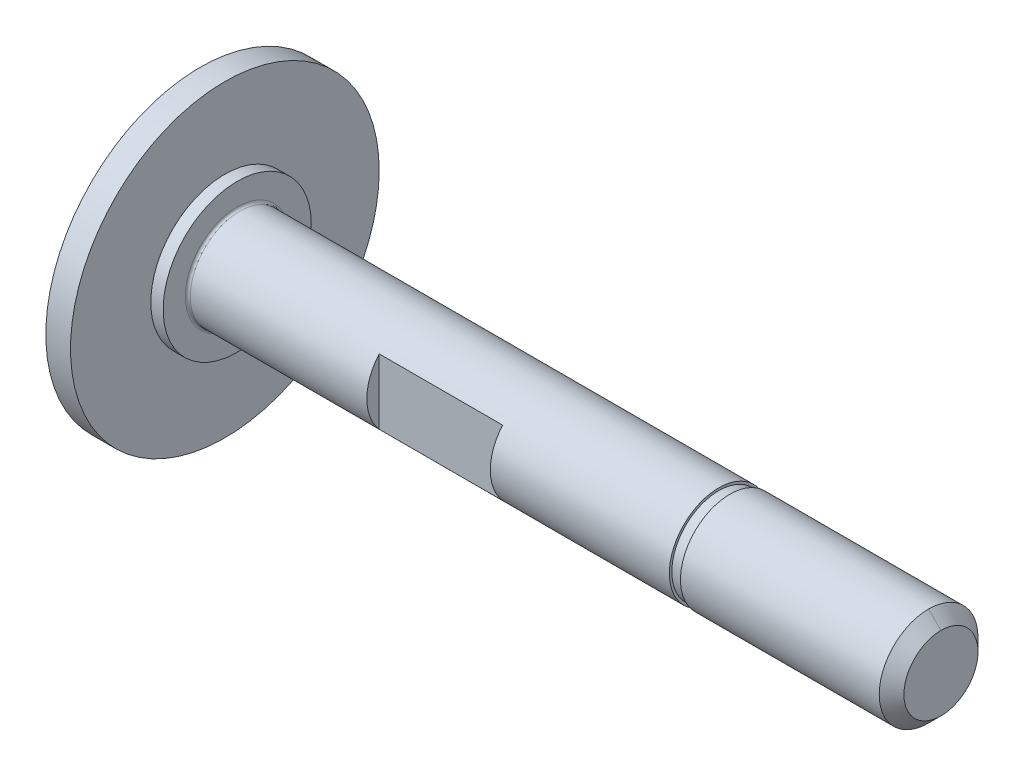
ISO-10303-21;
HEADER;
FILE_DESCRIPTION(('STEP AP214'),'2;1');
FILE_NAME('part.step','',(''),(''),'','','');
FILE_SCHEMA(('AUTOMOTIVE_DESIGN { 1 0 10303 214 1 1 1 1 }'));
ENDSEC;
DATA;
#1=APPLICATION_CONTEXT('core data for automotive mechanical design processes');
#2=APPLICATION_PROTOCOL_DEFINITION('international standard','automotive_design',2000,#1);
#3=PRODUCT_CONTEXT('',#1,'mechanical');
#4=PRODUCT('Part','Part','',(#3));
#5=PRODUCT_RELATED_PRODUCT_CATEGORY('part','',(#4));
#6=PRODUCT_DEFINITION_FORMATION('','',#4);
#7=PRODUCT_DEFINITION_CONTEXT('part definition',#1,'design');
#8=PRODUCT_DEFINITION('design','',#6,#7);
#9=PRODUCT_DEFINITION_SHAPE('','',#8);
#10=(LENGTH_UNIT() NAMED_UNIT(*) SI_UNIT(.MILLI.,.METRE.));
#11=(NAMED_UNIT(*) PLANE_ANGLE_UNIT() SI_UNIT($,.RADIAN.));
#12=(NAMED_UNIT(*) SI_UNIT($,.STERADIAN.) SOLID_ANGLE_UNIT());
#13=UNCERTAINTY_MEASURE_WITH_UNIT(LENGTH_MEASURE(1.E-05),#10,'distance_accuracy_value','');
#14=(GEOMETRIC_REPRESENTATION_CONTEXT(3) GLOBAL_UNCERTAINTY_ASSIGNED_CONTEXT((#13)) GLOBAL_UNIT_ASSIGNED_CONTEXT((#10,
#11,#12)) REPRESENTATION_CONTEXT('',''));
#15=CARTESIAN_POINT('',(0.,0.,0.));
#16=DIRECTION('',(0.,0.,1.));
#17=DIRECTION('',(1.,0.,0.));
#18=AXIS2_PLACEMENT_3D('',#15,#16,#17);
#19=CARTESIAN_POINT('',(60.,0.,0.));
#20=DIRECTION('',(1.,0.,0.));
#21=DIRECTION('',(0.,0.,-1.));
#22=AXIS2_PLACEMENT_3D('',#19,#20,#21);
#23=PLANE('',#22);
#24=CARTESIAN_POINT('',(60.0000000000495,0.,-5.71552570961101E-13));
#25=DIRECTION('',(-1.,0.,5.71877831696545E-13));
#26=DIRECTION('',(5.71877831696545E-13,0.,1.));
#27=AXIS2_PLACEMENT_3D('',#24,#25,#26);
#28=CIRCLE('',#27,2.999999999943);
#29=CARTESIAN_POINT('',(60.0000000000259,2.99999999992904,0.));
#30=VERTEX_POINT('',#29);
#31=CARTESIAN_POINT('',(59.9999999999974,-2.99999999996447,1.42733722536464E-07));
#32=VERTEX_POINT('',#31);
#33=EDGE_CURVE('E62',#30,#32,#28,.T.);
#34=ORIENTED_EDGE('',*,*,#33,.F.);
#35=CARTESIAN_POINT('',(59.9999999999454,0.,0.));
#36=DIRECTION('',(-1.,0.,0.));
#37=DIRECTION('',(0.,-1.,0.));
#38=AXIS2_PLACEMENT_3D('',#35,#36,#37);
#39=CIRCLE('',#38,2.9999999999859);
#40=EDGE_CURVE('E76',#32,#30,#39,.T.);
#41=ORIENTED_EDGE('',*,*,#40,.F.);
#42=EDGE_LOOP('',(#34,#41));
#43=FACE_BOUND('',#42,.T.);
#44=ADVANCED_FACE('F16',(#43),#23,.T.);
#45=CARTESIAN_POINT('',(59.0000000001958,0.,0.));
#46=DIRECTION('',(-1.,0.,5.71877831696545E-13));
#47=DIRECTION('',(5.71877831696545E-13,0.,1.));
#48=AXIS2_PLACEMENT_3D('',#45,#46,#47);
#49=CONICAL_SURFACE('',#48,3.99999999980718,0.785398163402721);
#50=DIRECTION('',(0.707106781186865,-0.70710678118623,0.));
#51=VECTOR('',#50,1.);
#52=CARTESIAN_POINT('',(-498937.000000448,499000.,-3.73431461534899E-11));
#53=LINE('',#52,#51);
#54=CARTESIAN_POINT('',(59.0000000000065,3.99999999999056,0.));
#55=VERTEX_POINT('',#54);
#56=EDGE_CURVE('E72',#30,#55,#53,.F.);
#57=ORIENTED_EDGE('',*,*,#56,.F.);
#58=ORIENTED_EDGE('',*,*,#33,.T.);
#59=CARTESIAN_POINT('',(59.0000000000259,-3.99999999996226,0.));
#60=CARTESIAN_POINT('',(59.0416666666631,-3.95833333330594,7.92965032878056E-09));
#61=CARTESIAN_POINT('',(59.083333333298,-3.91666666664742,1.5611499840076E-08));
#62=CARTESIAN_POINT('',(59.1666666666248,-3.83333333329248,3.04795962298971E-08));
#63=CARTESIAN_POINT('',(59.2083333333165,-3.79166666659607,3.76658431078594E-08));
#64=CARTESIAN_POINT('',(59.2916666666951,-3.708333333255,5.15427336929541E-08));
#65=CARTESIAN_POINT('',(59.3333333333818,-3.66666666661035,5.82333774004246E-08));
#66=CARTESIAN_POINT('',(59.4166666667092,-3.58333333327505,7.11190608004908E-08));
#67=CARTESIAN_POINT('',(59.4583333333499,-3.54166666658439,7.73141004930864E-08));
#68=CARTESIAN_POINT('',(59.5416666666783,-3.45833333325008,8.92085766418609E-08));
#69=CARTESIAN_POINT('',(59.583333333366,-3.41666666660643,9.49080130980397E-08));
#70=CARTESIAN_POINT('',(59.6666666666847,-3.33333333331922,1.05811283841286E-07));
#71=CARTESIAN_POINT('',(59.7083333333157,-3.29166666667566,1.11015118128691E-07));
#72=CARTESIAN_POINT('',(59.7916666666439,-3.20833333334116,1.20927182391884E-07));
#73=CARTESIAN_POINT('',(59.8333333333411,-3.16666666665021,1.25635412366996E-07));
#74=CARTESIAN_POINT('',(59.9166666666788,-3.08333333330621,1.34556269574104E-07));
#75=CARTESIAN_POINT('',(59.9583333333192,-3.04166666665315,1.38768896806664E-07));
#76=CARTESIAN_POINT('',(59.9999999999454,-2.9999999999859,1.42733723461607E-07));
#77=B_SPLINE_CURVE_WITH_KNOTS('',3,(#59,#60,#61,#62,#63,#64,#65,#66,#67,#68,#69,#70,#71,#72,#73,
#74,#75,#76),.UNSPECIFIED.,.F.,.F.,(4,2,2,2,2,2,2,2,4),(0.,0.176776695212069,0.353553390625111,
0.530330085917569,0.707106781210027,0.883883476502484,1.06066017167436,1.2374368670874,
1.41421356229947),.UNSPECIFIED.);
#78=CARTESIAN_POINT('',(59.0000000000065,-3.99999999999056,0.));
#79=VERTEX_POINT('',#78);
#80=EDGE_CURVE('E70',#79,#32,#77,.T.);
#81=ORIENTED_EDGE('',*,*,#80,.F.);
#82=CARTESIAN_POINT('',(59.,0.,0.));
#83=DIRECTION('',(1.,0.,0.));
#84=DIRECTION('',(0.,0.,-1.));
#85=AXIS2_PLACEMENT_3D('',#82,#83,#84);
#86=CIRCLE('',#85,4.);
#87=EDGE_CURVE('E80',#55,#79,#86,.F.);
#88=ORIENTED_EDGE('',*,*,#87,.F.);
#89=EDGE_LOOP('',(#57,#58,#81,#88));
#90=FACE_BOUND('',#89,.T.);
#91=ADVANCED_FACE('F68',(#90),#49,.T.);
#92=CARTESIAN_POINT('',(59.0000000000259,0.,0.));
#93=DIRECTION('',(-1.,0.,0.));
#94=DIRECTION('',(0.,-1.,0.));
#95=AXIS2_PLACEMENT_3D('',#92,#93,#94);
#96=CONICAL_SURFACE('',#95,3.99999999996226,0.785398163425874);
#97=ORIENTED_EDGE('',*,*,#80,.T.);
#98=ORIENTED_EDGE('',*,*,#40,.T.);
#99=ORIENTED_EDGE('',*,*,#56,.T.);
#100=CARTESIAN_POINT('',(59.,0.,0.));
#101=DIRECTION('',(1.,0.,0.));
#102=DIRECTION('',(0.,0.,-1.));
#103=AXIS2_PLACEMENT_3D('',#100,#101,#102);
#104=CIRCLE('',#103,4.);
#105=EDGE_CURVE('E78',#79,#55,#104,.F.);
#106=ORIENTED_EDGE('',*,*,#105,.F.);
#107=EDGE_LOOP('',(#97,#98,#99,#106));
#108=FACE_BOUND('',#107,.T.);
#109=ADVANCED_FACE('F75',(#108),#96,.T.);
#110=CARTESIAN_POINT('',(31.5,0.,0.));
#111=DIRECTION('',(1.,0.,0.));
#112=DIRECTION('',(0.,0.,-1.));
#113=AXIS2_PLACEMENT_3D('',#110,#111,#112);
#114=CYLINDRICAL_SURFACE('',#113,4.);
#115=ORIENTED_EDGE('',*,*,#87,.T.);
#116=ORIENTED_EDGE('',*,*,#105,.T.);
#117=EDGE_LOOP('',(#115,#116));
#118=FACE_BOUND('',#117,.T.);
#119=CARTESIAN_POINT('',(42.9,0.,0.));
#120=DIRECTION('',(1.,0.,0.));
#121=DIRECTION('',(0.,0.,-1.));
#122=AXIS2_PLACEMENT_3D('',#119,#120,#121);
#123=CIRCLE('',#122,4.);
#124=CARTESIAN_POINT('',(42.9,0.,-4.));
#125=VERTEX_POINT('',#124);
#126=EDGE_CURVE('E84',#125,#125,#123,.T.);
#127=ORIENTED_EDGE('',*,*,#126,.T.);
#128=EDGE_LOOP('',(#127));
#129=FACE_BOUND('',#128,.T.);
#130=ADVANCED_FACE('F129',(#118,#129),#114,.T.);
#131=CARTESIAN_POINT('',(42.9,3.8,0.));
#132=DIRECTION('',(1.,0.,0.));
#133=DIRECTION('',(0.,0.,-1.));
#134=AXIS2_PLACEMENT_3D('',#131,#132,#133);
#135=PLANE('',#134);
#136=CARTESIAN_POINT('',(42.9,0.,0.));
#137=DIRECTION('',(1.,0.,0.));
#138=DIRECTION('',(0.,0.,-1.));
#139=AXIS2_PLACEMENT_3D('',#136,#137,#138);
#140=CIRCLE('',#139,3.8);
#141=CARTESIAN_POINT('',(42.9,0.,-3.8));
#142=VERTEX_POINT('',#141);
#143=EDGE_CURVE('E151',#142,#142,#140,.F.);
#144=ORIENTED_EDGE('',*,*,#143,.F.);
#145=EDGE_LOOP('',(#144));
#146=FACE_BOUND('',#145,.T.);
#147=ORIENTED_EDGE('',*,*,#126,.F.);
#148=EDGE_LOOP('',(#147));
#149=FACE_BOUND('',#148,.T.);
#150=ADVANCED_FACE('F159',(#146,#149),#135,.F.);
#151=CARTESIAN_POINT('',(42.45,0.,0.));
#152=DIRECTION('',(1.,0.,0.));
#153=DIRECTION('',(0.,0.,-1.));
#154=AXIS2_PLACEMENT_3D('',#151,#152,#153);
#155=CYLINDRICAL_SURFACE('',#154,3.8);
#156=ORIENTED_EDGE('',*,*,#143,.T.);
#157=EDGE_LOOP('',(#156));
#158=FACE_BOUND('',#157,.T.);
#159=CARTESIAN_POINT('',(42.,0.,0.));
#160=DIRECTION('',(1.,0.,0.));
#161=DIRECTION('',(0.,0.,-1.));
#162=AXIS2_PLACEMENT_3D('',#159,#160,#161);
#163=CIRCLE('',#162,3.8);
#164=CARTESIAN_POINT('',(42.,0.,-3.8));
#165=VERTEX_POINT('',#164);
#166=EDGE_CURVE('E115',#165,#165,#163,.F.);
#167=ORIENTED_EDGE('',*,*,#166,.F.);
#168=EDGE_LOOP('',(#167));
#169=FACE_BOUND('',#168,.T.);
#170=ADVANCED_FACE('F161',(#158,#169),#155,.T.);
#171=CARTESIAN_POINT('',(42.,11.1101222306,0.));
#172=DIRECTION('',(1.,0.,0.));
#173=DIRECTION('',(0.,0.,-1.));
#174=AXIS2_PLACEMENT_3D('',#171,#172,#173);
#175=PLANE('',#174);
#176=ORIENTED_EDGE('',*,*,#166,.T.);
#177=EDGE_LOOP('',(#176));
#178=FACE_BOUND('',#177,.T.);
#179=CARTESIAN_POINT('',(42.,0.,0.));
#180=DIRECTION('',(1.,0.,0.));
#181=DIRECTION('',(0.,0.,-1.));
#182=AXIS2_PLACEMENT_3D('',#179,#180,#181);
#183=CIRCLE('',#182,4.);
#184=CARTESIAN_POINT('',(42.,0.,-4.));
#185=VERTEX_POINT('',#184);
#186=EDGE_CURVE('E108',#185,#185,#183,.F.);
#187=ORIENTED_EDGE('',*,*,#186,.F.);
#188=EDGE_LOOP('',(#187));
#189=FACE_BOUND('',#188,.T.);
#190=ADVANCED_FACE('F168',(#178,#189),#175,.T.);
#191=CARTESIAN_POINT('',(27.5,0.,7.7481508255));
#192=DIRECTION('',(1.,0.,0.));
#193=DIRECTION('',(0.,0.,-1.));
#194=AXIS2_PLACEMENT_3D('',#191,#192,#193);
#195=PLANE('',#194);
#196=DIRECTION('',(0.,1.,0.));
#197=VECTOR('',#196,1.);
#198=CARTESIAN_POINT('',(27.5,0.,3.));
#199=LINE('',#198,#197);
#200=CARTESIAN_POINT('',(27.5,-2.6457513110633,3.00000000000114));
#201=VERTEX_POINT('',#200);
#202=CARTESIAN_POINT('',(27.5,2.6457513110633,3.00000000000114));
#203=VERTEX_POINT('',#202);
#204=EDGE_CURVE('E109',#201,#203,#199,.T.);
#205=ORIENTED_EDGE('',*,*,#204,.F.);
#206=CARTESIAN_POINT('',(27.5,0.,0.));
#207=DIRECTION('',(1.,0.,0.));
#208=DIRECTION('',(0.,0.,-1.));
#209=AXIS2_PLACEMENT_3D('',#206,#207,#208);
#210=CIRCLE('',#209,4.);
#211=EDGE_CURVE('E111',#203,#201,#210,.T.);
#212=ORIENTED_EDGE('',*,*,#211,.F.);
#213=EDGE_LOOP('',(#205,#212));
#214=FACE_BOUND('',#213,.T.);
#215=ADVANCED_FACE('F232',(#214),#195,.F.);
#216=CARTESIAN_POINT('',(17.5,0.,3.));
#217=DIRECTION('',(0.,0.,1.));
#218=DIRECTION('',(1.,0.,0.));
#219=AXIS2_PLACEMENT_3D('',#216,#217,#218);
#220=PLANE('',#219);
#221=DIRECTION('',(1.,0.,0.));
#222=VECTOR('',#221,1.);
#223=CARTESIAN_POINT('',(31.5,2.64575131106201,3.00000000000228));
#224=LINE('',#223,#222);
#225=CARTESIAN_POINT('',(17.5,2.6457513110633,3.00000000000114));
#226=VERTEX_POINT('',#225);
#227=EDGE_CURVE('E112',#226,#203,#224,.T.);
#228=ORIENTED_EDGE('',*,*,#227,.F.);
#229=DIRECTION('',(0.,1.,0.));
#230=VECTOR('',#229,1.);
#231=CARTESIAN_POINT('',(17.5,0.,3.));
#232=LINE('',#231,#230);
#233=CARTESIAN_POINT('',(17.5,-2.6457513110633,3.00000000000114));
#234=VERTEX_POINT('',#233);
#235=EDGE_CURVE('E105',#226,#234,#232,.F.);
#236=ORIENTED_EDGE('',*,*,#235,.T.);
#237=DIRECTION('',(1.,0.,0.));
#238=VECTOR('',#237,1.);
#239=CARTESIAN_POINT('',(31.5,-2.64575131106201,3.00000000000228));
#240=LINE('',#239,#238);
#241=EDGE_CURVE('E99',#201,#234,#240,.F.);
#242=ORIENTED_EDGE('',*,*,#241,.F.);
#243=ORIENTED_EDGE('',*,*,#204,.T.);
#244=EDGE_LOOP('',(#228,#236,#242,#243));
#245=FACE_BOUND('',#244,.T.);
#246=ADVANCED_FACE('F228',(#245),#220,.T.);
#247=CARTESIAN_POINT('',(17.5,0.,3.));
#248=DIRECTION('',(-1.,0.,0.));
#249=DIRECTION('',(0.,0.,1.));
#250=AXIS2_PLACEMENT_3D('',#247,#248,#249);
#251=PLANE('',#250);
#252=ORIENTED_EDGE('',*,*,#235,.F.);
#253=CARTESIAN_POINT('',(17.5,0.,0.));
#254=DIRECTION('',(1.,0.,0.));
#255=DIRECTION('',(0.,0.,-1.));
#256=AXIS2_PLACEMENT_3D('',#253,#254,#255);
#257=CIRCLE('',#256,4.);
#258=EDGE_CURVE('E94',#234,#226,#257,.F.);
#259=ORIENTED_EDGE('',*,*,#258,.F.);
#260=EDGE_LOOP('',(#252,#259));
#261=FACE_BOUND('',#260,.T.);
#262=ADVANCED_FACE('F224',(#261),#251,.F.);
#263=CARTESIAN_POINT('',(31.5,0.,0.));
#264=DIRECTION('',(1.,0.,0.));
#265=DIRECTION('',(0.,0.,-1.));
#266=AXIS2_PLACEMENT_3D('',#263,#264,#265);
#267=CYLINDRICAL_SURFACE('',#266,4.);
#268=ORIENTED_EDGE('',*,*,#186,.T.);
#269=EDGE_LOOP('',(#268));
#270=FACE_BOUND('',#269,.T.);
#271=ORIENTED_EDGE('',*,*,#241,.T.);
#272=ORIENTED_EDGE('',*,*,#258,.T.);
#273=ORIENTED_EDGE('',*,*,#227,.T.);
#274=ORIENTED_EDGE('',*,*,#211,.T.);
#275=EDGE_LOOP('',(#271,#272,#273,#274));
#276=FACE_BOUND('',#275,.T.);
#277=CARTESIAN_POINT('',(3.2,0.,0.));
#278=DIRECTION('',(1.,0.,0.));
#279=DIRECTION('',(0.,1.,0.));
#280=AXIS2_PLACEMENT_3D('',#277,#278,#279);
#281=CIRCLE('',#280,4.);
#282=CARTESIAN_POINT('',(3.2,3.99999999999996,0.));
#283=VERTEX_POINT('',#282);
#284=EDGE_CURVE('E91',#283,#283,#281,.T.);
#285=ORIENTED_EDGE('',*,*,#284,.T.);
#286=EDGE_LOOP('',(#285));
#287=FACE_BOUND('',#286,.T.);
#288=ADVANCED_FACE('F220',(#270,#276,#287),#267,.T.);
#289=CARTESIAN_POINT('',(3.2,0.,0.));
#290=DIRECTION('',(1.,0.,0.));
#291=DIRECTION('',(0.,1.,0.));
#292=AXIS2_PLACEMENT_3D('',#289,#290,#291);
#293=TOROIDAL_SURFACE('',#292,4.2,0.2);
#294=CARTESIAN_POINT('',(3.,0.,0.));
#295=DIRECTION('',(1.,0.,0.));
#296=DIRECTION('',(0.,1.,0.));
#297=AXIS2_PLACEMENT_3D('',#294,#295,#296);
#298=CIRCLE('',#297,4.19999999999998);
#299=CARTESIAN_POINT('',(3.,-4.20000000000002,-2.27429533490532E-08));
#300=VERTEX_POINT('',#299);
#301=CARTESIAN_POINT('',(3.,4.19999999999997,0.));
#302=VERTEX_POINT('',#301);
#303=EDGE_CURVE('E89',#300,#302,#298,.F.);
#304=ORIENTED_EDGE('',*,*,#303,.F.);
#305=CARTESIAN_POINT('',(3.,-4.2,-3.79049233025473E-08));
#306=CARTESIAN_POINT('',(3.00000000122142,-4.19998896168551,-0.0440147795591735));
#307=CARTESIAN_POINT('',(3.00000000061645,-4.19929366573009,-0.08802938089377));
#308=CARTESIAN_POINT('',(2.99999999986475,-4.19653586129786,-0.176010267095718));
#309=CARTESIAN_POINT('',(2.99999999971797,-4.19447352231974,-0.219976557276275));
#310=CARTESIAN_POINT('',(3.00000000399167,-4.18898324068096,-0.307818768898119));
#311=CARTESIAN_POINT('',(3.00000000841165,-4.18555545195131,-0.351694699965609));
#312=CARTESIAN_POINT('',(3.00000005335436,-4.17734108475753,-0.439314808807218));
#313=CARTESIAN_POINT('',(3.00000009387342,-4.17255464415892,-0.483058999494418));
#314=CARTESIAN_POINT('',(3.00000019873267,-4.16161664887987,-0.570372209552712));
#315=CARTESIAN_POINT('',(3.00000026307071,-4.15546521733321,-0.613941244363646));
#316=CARTESIAN_POINT('',(3.00000061697939,-4.14184584698131,-0.700869084372047));
#317=CARTESIAN_POINT('',(3.00000090653225,-4.13437801209836,-0.744227905887193));
#318=CARTESIAN_POINT('',(3.00000124114888,-4.11332905963182,-0.85515650735559));
#319=CARTESIAN_POINT('',(3.00000105481133,-4.09868125632063,-0.92252810382414));
#320=CARTESIAN_POINT('',(3.00000078718794,-4.07555561508848,-1.01754294170621));
#321=CARTESIAN_POINT('',(3.00000070776717,-4.06843753768916,-1.04552639334498));
#322=CARTESIAN_POINT('',(3.00000053823169,-4.05242563164218,-1.10584012477736));
#323=CARTESIAN_POINT('',(3.00000044845818,-4.0434305631774,-1.13814354677903));
#324=CARTESIAN_POINT('',(3.00000017840645,-4.01041335397259,-1.25144305998795));
#325=CARTESIAN_POINT('',(3.00000006785277,-3.98432409842724,-1.33185102627433));
#326=CARTESIAN_POINT('',(3.00000000217137,-3.93970172447261,-1.45654530122863));
#327=CARTESIAN_POINT('',(3.00000000051055,-3.92277851020109,-1.50141836867713));
#328=CARTESIAN_POINT('',(2.99999999949267,-3.88755457842849,-1.59029620633201));
#329=CARTESIAN_POINT('',(3.00000000012115,-3.8692632179309,-1.63430466714059));
#330=CARTESIAN_POINT('',(3.00000000118406,-3.83118465175768,-1.72166907209531));
#331=CARTESIAN_POINT('',(3.0000000016185,-3.81139745131664,-1.76502501852425));
#332=CARTESIAN_POINT('',(3.00000000269625,-3.77036266071234,-1.85104004905047));
#333=CARTESIAN_POINT('',(3.00000000333957,-3.74911507463749,-1.89369913509823));
#334=CARTESIAN_POINT('',(3.00000000452407,-3.70518072223722,-1.97826957379688));
#335=CARTESIAN_POINT('',(3.00000000506526,-3.68249395893356,-2.0201809280175));
#336=CARTESIAN_POINT('',(3.00000000598051,-3.63570839251955,-2.10320785998909));
#337=CARTESIAN_POINT('',(3.00000000635457,-3.6116095913857,-2.14432343885383));
#338=CARTESIAN_POINT('',(3.00000000685936,-3.5620275765532,-2.22571117006883));
#339=CARTESIAN_POINT('',(3.00000000699009,-3.53654436382344,-2.26598332300935));
#340=CARTESIAN_POINT('',(3.00000000698971,-3.48422305807387,-2.34563766715509));
#341=CARTESIAN_POINT('',(3.00000000685861,-3.45738496505405,-2.38501985836032));
#342=CARTESIAN_POINT('',(3.00000000635532,-3.40238491437145,-2.46284873533558));
#343=CARTESIAN_POINT('',(3.00000000598314,-3.37422295578216,-2.50129542045087));
#344=CARTESIAN_POINT('',(3.00000000506263,-3.31660773746946,-2.57720882667866));
#345=CARTESIAN_POINT('',(3.00000000451431,-3.28715447593865,-2.61467554641941));
#346=CARTESIAN_POINT('',(3.00000000334932,-3.22699071207999,-2.68858571240883));
#347=CARTESIAN_POINT('',(3.00000000273265,-3.19628020711259,-2.72502915650891));
#348=CARTESIAN_POINT('',(3.0000000015821,-3.13363742788885,-2.79685056903252));
#349=CARTESIAN_POINT('',(3.00000000104823,-3.10170515021249,-2.83222853447305));
#350=CARTESIAN_POINT('',(3.00000000025698,-3.03665586630392,-2.90187829774873));
#351=CARTESIAN_POINT('',(2.99999999999961,-3.00353885592641,-2.93615009171266));
#352=CARTESIAN_POINT('',(3.00000000000038,-2.93704086397231,-3.00266390232116));
#353=CARTESIAN_POINT('',(3.0000000002452,-2.90368953779714,-3.0349355743632));
#354=CARTESIAN_POINT('',(3.00000000110858,-2.8359724559094,-3.0983207449054));
#355=CARTESIAN_POINT('',(3.00000000172673,-2.80160785313536,-3.12943547505995));
#356=CARTESIAN_POINT('',(3.00000000322867,-2.7319055714588,-3.19047646750059));
#357=CARTESIAN_POINT('',(3.00000000411216,-2.69656900297935,-3.22040399780563));
#358=CARTESIAN_POINT('',(3.00000000604753,-2.62496472648154,-3.2790416220267));
#359=CARTESIAN_POINT('',(3.00000000709921,-2.58869808556055,-3.30775301900933));
#360=CARTESIAN_POINT('',(3.00000000928378,-2.51527647249645,-3.36393095456774));
#361=CARTESIAN_POINT('',(3.00000001041656,-2.47812252299273,-3.39139882969049));
#362=CARTESIAN_POINT('',(3.00000001268646,-2.40296982717775,-3.44506381197838));
#363=CARTESIAN_POINT('',(3.00000001382355,-2.36497205807039,-3.47126228763258));
#364=CARTESIAN_POINT('',(3.00000001603542,-2.28817595364073,-3.52236410556113));
#365=CARTESIAN_POINT('',(3.00000001711025,-2.24937854913739,-3.54726884668501));
#366=CARTESIAN_POINT('',(3.00000001914121,-2.17102803946329,-3.59576038590245));
#367=CARTESIAN_POINT('',(3.00000002009746,-2.13147581783992,-3.6193486116029));
#368=CARTESIAN_POINT('',(3.00000002184511,-2.05166112131396,-3.66518588065423));
#369=CARTESIAN_POINT('',(3.00000002263668,-2.01139948185484,-3.68743637874139));
#370=CARTESIAN_POINT('',(3.0000000240191,-1.93021192342192,-3.73057853492654));
#371=CARTESIAN_POINT('',(3.00000002461016,-1.88928679101261,-3.75147167324075));
#372=CARTESIAN_POINT('',(3.0000000255659,-1.80681869188683,-3.79188104370712));
#373=CARTESIAN_POINT('',(3.00000002593084,-1.7652764621379,-3.81139877988614));
#374=CARTESIAN_POINT('',(3.00000002641895,-1.68162102989298,-3.84904087917366));
#375=CARTESIAN_POINT('',(3.00000002654239,-1.63950851410724,-3.86716676843265));
#376=CARTESIAN_POINT('',(3.00000002654239,-1.55475973271792,-3.90201031217519));
#377=CARTESIAN_POINT('',(3.00000002641922,-1.5121241029649,-3.91872951323003));
#378=CARTESIAN_POINT('',(3.00000002593111,-1.42637662307618,-3.95074642812678));
#379=CARTESIAN_POINT('',(3.00000002556644,-1.38326535738713,-3.96604570724416));
#380=CARTESIAN_POINT('',(3.00000002461069,-1.2966143868856,-3.9952111373116));
#381=CARTESIAN_POINT('',(3.00000002401987,-1.25307521463006,-4.00907887051293));
#382=CARTESIAN_POINT('',(3.00000002263745,-1.16561640969143,-4.03537117965598));
#383=CARTESIAN_POINT('',(3.00000002184608,-1.12169725724823,-4.04779735308653));
#384=CARTESIAN_POINT('',(3.00000002009843,-1.03352661382597,-4.07119812404241));
#385=CARTESIAN_POINT('',(3.00000001914234,-0.989275550401116,-4.08217433254807));
#386=CARTESIAN_POINT('',(3.00000001711138,-0.900489296843891,-4.10266836219108));
#387=CARTESIAN_POINT('',(3.00000001603665,-0.855954481269379,-4.11218780604838));
#388=CARTESIAN_POINT('',(3.00000001382478,-0.766648970063475,-4.12976309731348));
#389=CARTESIAN_POINT('',(3.00000001268772,-0.721878595743437,-4.13782057742486));
#390=CARTESIAN_POINT('',(3.00000001041783,-0.632150202389025,-4.15246832711713));
#391=CARTESIAN_POINT('',(3.00000000928499,-0.587192451220135,-4.15906023762803));
#392=CARTESIAN_POINT('',(3.00000000710043,-0.497137450935077,-4.17077482309454));
#393=CARTESIAN_POINT('',(3.00000000604862,-0.452040416125386,-4.17589914544653));
#394=CARTESIAN_POINT('',(3.00000000411323,-0.361754948083878,-4.18467809928214));
#395=CARTESIAN_POINT('',(3.00000000322946,-0.316566675439362,-4.18833438288076));
#396=CARTESIAN_POINT('',(3.0000000017276,-0.226146386311074,-4.19417839628858));
#397=CARTESIAN_POINT('',(3.00000000110921,-0.180914476984091,-4.19636778114857));
#398=CARTESIAN_POINT('',(3.00000000024554,-0.0904553652401572,-4.19928058490533));
#399=CARTESIAN_POINT('',(2.99999999999984,-0.0452282154352698,-4.20000566015645));
#400=CARTESIAN_POINT('',(3.00000000000022,0.0607095605795573,-4.19999240241172));
#401=CARTESIAN_POINT('',(3.00000000044343,0.121421056354254,-4.19866820197347));
#402=CARTESIAN_POINT('',(3.00000000212479,0.242094822830712,-4.19341706384312));
#403=CARTESIAN_POINT('',(3.00000000335459,0.302058295960163,-4.18951745481002));
#404=CARTESIAN_POINT('',(3.00000000650293,0.42113128215879,-4.17920439198526));
#405=CARTESIAN_POINT('',(3.00000000841405,0.480243128603828,-4.17281790476272));
#406=CARTESIAN_POINT('',(3.00000001282385,0.597513524709712,-4.1576233312261));
#407=CARTESIAN_POINT('',(3.00000001531603,0.655675517239225,-4.14884180207428));
#408=CARTESIAN_POINT('',(3.00000002079134,0.770954593591918,-4.12895208607009));
#409=CARTESIAN_POINT('',(3.00000002376889,0.828076182316996,-4.11787000470655));
#410=CARTESIAN_POINT('',(3.00000003012304,0.941189872644432,-4.09347639847363));
#411=CARTESIAN_POINT('',(3.00000003349495,0.997187499193966,-4.08019048792197));
#412=CARTESIAN_POINT('',(3.00000004055063,1.10797579371118,-4.05148824995551));
#413=CARTESIAN_POINT('',(3.00000004423056,1.16277296202923,-4.03609700952312));
#414=CARTESIAN_POINT('',(3.00000005181978,1.27108981876596,-4.00328452577025));
#415=CARTESIAN_POINT('',(3.00000005572605,1.32461693805955,-3.98588780905861));
#416=CARTESIAN_POINT('',(3.00000006369014,1.43033000340936,-3.94916576576721));
#417=CARTESIAN_POINT('',(3.00000006774574,1.48252426534583,-3.9298643754965));
#418=CARTESIAN_POINT('',(3.00000007593537,1.58551459575688,-3.88943497111323));
#419=CARTESIAN_POINT('',(3.00000008006798,1.63631981929322,-3.8683302761191));
#420=CARTESIAN_POINT('',(3.00000008834316,1.736481558401,-3.82439647649532));
#421=CARTESIAN_POINT('',(3.00000009248507,1.78584802221383,-3.80159004986803));
#422=CARTESIAN_POINT('',(3.00000010071515,1.88308805020642,-3.75435488625338));
#423=CARTESIAN_POINT('',(3.00000010480337,1.93097230979729,-3.72994816511162));
#424=CARTESIAN_POINT('',(3.000000112867,2.02520986518231,-3.67961407536328));
#425=CARTESIAN_POINT('',(3.00000011684318,2.07157455768539,-3.65370804220385));
#426=CARTESIAN_POINT('',(3.00000012462838,2.16274083584008,-3.60047625510113));
#427=CARTESIAN_POINT('',(3.00000012843884,2.20755447390464,-3.57317114067252));
#428=CARTESIAN_POINT('',(3.00000013584294,2.29559220550332,-3.51724110310272));
#429=CARTESIAN_POINT('',(3.00000013943866,2.33882896196801,-3.48863611062173));
#430=CARTESIAN_POINT('',(3.00000014636835,2.42369197453337,-3.43020495719286));
#431=CARTESIAN_POINT('',(3.00000014970498,2.46533145942324,-3.40039800764117));
#432=CARTESIAN_POINT('',(3.00000015607624,2.54698422501437,-3.33966007211128));
#433=CARTESIAN_POINT('',(3.00000015911411,2.58701125634226,-3.30874757026549));
#434=CARTESIAN_POINT('',(3.00000016485229,2.6654284282544,-3.24589393802286));
#435=CARTESIAN_POINT('',(3.00000016755636,2.70383279802046,-3.21397055879957));
#436=CARTESIAN_POINT('',(3.00000017259613,2.77899873920624,-3.14918865948775));
#437=CARTESIAN_POINT('',(3.00000017493607,2.81577497591167,-3.11634715411654));
#438=CARTESIAN_POINT('',(3.00000017922143,2.88768328166817,-3.04982039338569));
#439=CARTESIAN_POINT('',(3.00000018117154,2.92283041057176,-3.01615141487911));
#440=CARTESIAN_POINT('',(3.00000018465582,2.99148342788997,-2.94805884410077));
#441=CARTESIAN_POINT('',(3.00000018619508,3.02500473017543,-2.91365079139057));
#442=CARTESIAN_POINT('',(3.00000018884096,3.09041307592915,-2.84416681421612));
#443=CARTESIAN_POINT('',(3.00000018995302,3.12231584779354,-2.8091056944648));
#444=CARTESIAN_POINT('',(3.00000019173249,3.18449792799288,-2.73839980853164));
#445=CARTESIAN_POINT('',(3.00000019240565,3.21479324086759,-2.70276911642352));
#446=CARTESIAN_POINT('',(3.00000019330005,3.27377477227771,-2.6310056902663));
#447=CARTESIAN_POINT('',(3.00000019352729,3.30247723428526,-2.59488630549895));
#448=CARTESIAN_POINT('',(3.00000019352728,3.35829077235557,-2.52222438401486));
#449=CARTESIAN_POINT('',(3.00000019330624,3.38541829479333,-2.48569447924145));
#450=CARTESIAN_POINT('',(3.00000019241183,3.43810276144863,-2.41228763535169));
#451=CARTESIAN_POINT('',(3.00000019174481,3.46367632025034,-2.37542261951356));
#452=CARTESIAN_POINT('',(3.00000018996533,3.51327656238668,-2.30141878066981));
#453=CARTESIAN_POINT('',(3.00000018885929,3.53731999474837,-2.26429118310644));
#454=CARTESIAN_POINT('',(3.00000018621342,3.58388626730328,-2.189832686394));
#455=CARTESIAN_POINT('',(3.00000018468003,3.60642595977268,-2.15251232387969));
#456=CARTESIAN_POINT('',(3.00000018119568,3.65001372701375,-2.07773526560128));
#457=CARTESIAN_POINT('',(3.00000017925111,3.6710787226961,-2.04028843907365));
#458=CARTESIAN_POINT('',(3.00000017496596,3.71174734533879,-1.96532472325842));
#459=CARTESIAN_POINT('',(3.00000017263165,3.73136794608691,-1.92781701659292));
#460=CARTESIAN_POINT('',(3.00000016512833,3.78765934794962,-1.81612845253983));
#461=CARTESIAN_POINT('',(3.0000001593809,3.82272128642178,-1.74112812403824));
#462=CARTESIAN_POINT('',(3.00000014663818,3.88734674522358,-1.59152023625377));
#463=CARTESIAN_POINT('',(3.00000013968649,3.91704577452326,-1.51697099575646));
#464=CARTESIAN_POINT('',(3.00000012487797,3.97125759352923,-1.36867411355885));
#465=CARTESIAN_POINT('',(3.00000011705667,3.99590459231704,-1.29497555980445));
#466=CARTESIAN_POINT('',(3.00000010092899,4.04033771686751,-1.1487511996421));
#467=CARTESIAN_POINT('',(3.00000009264677,4.06025619453118,-1.07626557634914));
#468=CARTESIAN_POINT('',(3.0000000760962,4.09557131814593,-0.93279180313339));
#469=CARTESIAN_POINT('',(3.0000000678368,4.11109780990804,-0.861835596252487));
#470=CARTESIAN_POINT('',(3.00000005190743,4.1379755171689,-0.721703484681328));
#471=CARTESIAN_POINT('',(3.00000004422694,4.14945354787602,-0.652551882552357));
#472=CARTESIAN_POINT('',(3.00000003011757,4.16858476305794,-0.516271455701841));
#473=CARTESIAN_POINT('',(3.00000002365348,4.17636126334196,-0.449159923547169));
#474=CARTESIAN_POINT('',(3.00000001269313,4.18843932396716,-0.317164345761867));
#475=CARTESIAN_POINT('',(3.00000000813212,4.19286032656213,-0.252291210719483));
#476=CARTESIAN_POINT('',(3.00000000186666,4.19857570679579,-0.124942019289948));
#477=CARTESIAN_POINT('',(3.00000000005777,4.19998526221248,-0.0624711141826237));
#478=CARTESIAN_POINT('',(3.,4.2,0.));
#479=B_SPLINE_CURVE_WITH_KNOTS('',3,(#305,#306,#307,#308,#309,#310,#311,#312,#313,#314,#315,
#316,#317,#318,#319,#320,#321,#322,#323,#324,#325,#326,#327,#328,#329,#330,#331,#332,#333,#334,
#335,#336,#337,#338,#339,#340,#341,#342,#343,#344,#345,#346,#347,#348,#349,#350,#351,#352,#353,
#354,#355,#356,#357,#358,#359,#360,#361,#362,#363,#364,#365,#366,#367,#368,#369,#370,#371,#372,
#373,#374,#375,#376,#377,#378,#379,#380,#381,#382,#383,#384,#385,#386,#387,#388,#389,#390,#391,
#392,#393,#394,#395,#396,#397,#398,#399,#400,#401,#402,#403,#404,#405,#406,#407,#408,#409,#410,
#411,#412,#413,#414,#415,#416,#417,#418,#419,#420,#421,#422,#423,#424,#425,#426,#427,#428,#429,
#430,#431,#432,#433,#434,#435,#436,#437,#438,#439,#440,#441,#442,#443,#444,#445,#446,#447,#448,
#449,#450,#451,#452,#453,#454,#455,#456,#457,#458,#459,#460,#461,#462,#463,#464,#465,#466,#467,
#468,#469,#470,#471,#472,#473,#474,#475,#476,#477,#478),.UNSPECIFIED.,.F.,.F.,(4,2,2,2,2,2,2,2,
2,2,2,2,2,2,2,2,2,2,2,2,2,2,2,2,2,2,2,2,2,2,2,2,2,2,2,2,2,2,2,2,2,2,2,2,2,2,2,2,2,2,2,2,2,2,2,2,
2,2,2,2,2,2,2,2,2,2,2,2,2,2,2,2,2,2,2,2,2,2,2,2,2,2,2,2,2,2,4),(0.,0.132038980932041,
0.26406159350642,0.396069327010017,0.528063670171533,0.660046111158113,0.792018137569248,
0.998746388534395,1.08536584424064,1.18595584114385,1.4393758744054,1.58322931349256,
1.72617583832979,1.8691218629595,2.01206748742318,2.15501281176234,2.2979579360185,
2.44090296023315,2.5838479844478,2.72679310870396,2.86973843304312,3.0126840575068,
3.15563008213651,3.29857660697374,3.43777746704531,3.57682562709537,3.7157210386172,
3.85446365326082,3.99305342283291,4.13149029929694,4.26977423477305,4.40790518153815,
4.54588309202585,4.68370791882648,4.82137961468711,4.95889813251153,5.09626342536026,
5.23347544645052,5.3705341491563,5.50743948700828,5.64419141369386,5.7807898830572,
5.91723484909915,6.05352626597729,6.18966408800595,6.32564826965617,6.46147876555571,
6.59715553048907,6.7792734999404,6.95948934407883,7.13780311480309,7.31421486279763,
7.48872463753271,7.66133248726427,7.83203845903403,8.00084259866939,8.16774495078348,
8.33274555877513,8.49584446482885,8.65704170991485,8.81633733378902,8.97373137499292,
9.1292238708538,9.28281485748454,9.43450436978372,9.58429244143556,9.73217910490998,
9.87816439146251,10.0222483311344,10.1644309527525,10.3047122839294,10.4430923510633,
10.5795711793381,10.7141487927234,10.8468252139745,10.9776004646324,11.1064745650238,
11.233447534261,11.4816630615845,11.7222766789084,11.9552883474459,12.1806980136628,
12.3985056092783,12.6087110512658,12.8113142418532,13.0063150685247,13.1937134040224),.UNSPECIFIED.);
#480=EDGE_CURVE('E35',#302,#300,#479,.F.);
#481=ORIENTED_EDGE('',*,*,#480,.F.);
#482=EDGE_LOOP('',(#304,#481));
#483=FACE_BOUND('',#482,.T.);
#484=ORIENTED_EDGE('',*,*,#284,.F.);
#485=EDGE_LOOP('',(#484));
#486=FACE_BOUND('',#485,.T.);
#487=ADVANCED_FACE('F87',(#483,#486),#293,.F.);
#488=CARTESIAN_POINT('',(3.,0.,0.));
#489=DIRECTION('',(1.,0.,0.));
#490=DIRECTION('',(0.,0.,-1.));
#491=AXIS2_PLACEMENT_3D('',#488,#489,#490);
#492=PLANE('',#491);
#493=ORIENTED_EDGE('',*,*,#480,.T.);
#494=ORIENTED_EDGE('',*,*,#303,.T.);
#495=EDGE_LOOP('',(#493,#494));
#496=FACE_BOUND('',#495,.T.);
#497=CARTESIAN_POINT('',(3.,0.,0.));
#498=DIRECTION('',(1.,0.,0.));
#499=DIRECTION('',(0.,0.,-1.));
#500=AXIS2_PLACEMENT_3D('',#497,#498,#499);
#501=CIRCLE('',#500,6.);
#502=CARTESIAN_POINT('',(3.,0.,-6.));
#503=VERTEX_POINT('',#502);
#504=EDGE_CURVE('E92',#503,#503,#501,.F.);
#505=ORIENTED_EDGE('',*,*,#504,.F.);
#506=EDGE_LOOP('',(#505));
#507=FACE_BOUND('',#506,.T.);
#508=ADVANCED_FACE('F190',(#496,#507),#492,.T.);
#509=CARTESIAN_POINT('',(2.5,0.,0.));
#510=DIRECTION('',(1.,0.,0.));
#511=DIRECTION('',(0.,0.,-1.));
#512=AXIS2_PLACEMENT_3D('',#509,#510,#511);
#513=CYLINDRICAL_SURFACE('',#512,6.);
#514=CARTESIAN_POINT('',(2.,0.,0.));
#515=DIRECTION('',(1.,0.,0.));
#516=DIRECTION('',(0.,0.,-1.));
#517=AXIS2_PLACEMENT_3D('',#514,#515,#516);
#518=CIRCLE('',#517,6.);
#519=CARTESIAN_POINT('',(2.,0.,-6.));
#520=VERTEX_POINT('',#519);
#521=EDGE_CURVE('E142',#520,#520,#518,.F.);
#522=ORIENTED_EDGE('',*,*,#521,.F.);
#523=EDGE_LOOP('',(#522));
#524=FACE_BOUND('',#523,.T.);
#525=ORIENTED_EDGE('',*,*,#504,.T.);
#526=EDGE_LOOP('',(#525));
#527=FACE_BOUND('',#526,.T.);
#528=ADVANCED_FACE('F186',(#524,#527),#513,.T.);
#529=CARTESIAN_POINT('',(2.,0.,0.));
#530=DIRECTION('',(1.,0.,0.));
#531=DIRECTION('',(0.,0.,-1.));
#532=AXIS2_PLACEMENT_3D('',#529,#530,#531);
#533=PLANE('',#532);
#534=ORIENTED_EDGE('',*,*,#521,.T.);
#535=EDGE_LOOP('',(#534));
#536=FACE_BOUND('',#535,.T.);
#537=CARTESIAN_POINT('',(2.,0.,0.));
#538=DIRECTION('',(1.,0.,0.));
#539=DIRECTION('',(0.,0.,-1.));
#540=AXIS2_PLACEMENT_3D('',#537,#538,#539);
#541=CIRCLE('',#540,12.5);
#542=CARTESIAN_POINT('',(2.,0.,-12.5));
#543=VERTEX_POINT('',#542);
#544=EDGE_CURVE('E27',#543,#543,#541,.F.);
#545=ORIENTED_EDGE('',*,*,#544,.F.);
#546=EDGE_LOOP('',(#545));
#547=FACE_BOUND('',#546,.T.);
#548=ADVANCED_FACE('F179',(#536,#547),#533,.T.);
#549=CARTESIAN_POINT('',(1.,0.,0.));
#550=DIRECTION('',(1.,0.,0.));
#551=DIRECTION('',(0.,0.,-1.));
#552=AXIS2_PLACEMENT_3D('',#549,#550,#551);
#553=CYLINDRICAL_SURFACE('',#552,12.5);
#554=CARTESIAN_POINT('',(0.,0.,0.));
#555=DIRECTION('',(1.,0.,0.));
#556=DIRECTION('',(0.,0.,-1.));
#557=AXIS2_PLACEMENT_3D('',#554,#555,#556);
#558=CIRCLE('',#557,12.5);
#559=CARTESIAN_POINT('',(0.,0.,-12.5));
#560=VERTEX_POINT('',#559);
#561=EDGE_CURVE('E11',#560,#560,#558,.T.);
#562=ORIENTED_EDGE('',*,*,#561,.T.);
#563=EDGE_LOOP('',(#562));
#564=FACE_BOUND('',#563,.T.);
#565=ORIENTED_EDGE('',*,*,#544,.T.);
#566=EDGE_LOOP('',(#565));
#567=FACE_BOUND('',#566,.T.);
#568=ADVANCED_FACE('F173',(#564,#567),#553,.T.);
#569=CARTESIAN_POINT('',(0.,0.,0.));
#570=DIRECTION('',(1.,0.,0.));
#571=DIRECTION('',(0.,0.,-1.));
#572=AXIS2_PLACEMENT_3D('',#569,#570,#571);
#573=PLANE('',#572);
#574=ORIENTED_EDGE('',*,*,#561,.F.);
#575=EDGE_LOOP('',(#574));
#576=FACE_BOUND('',#575,.T.);
#577=ADVANCED_FACE('F171',(#576),#573,.F.);
#578=CLOSED_SHELL('',(#44,#91,#109,#130,#150,#170,#190,#215,#246,#262,#288,#487,#508,#528,#548,
#568,#577));
#579=MANIFOLD_SOLID_BREP('B1',#578);
#580=ADVANCED_BREP_SHAPE_REPRESENTATION('',(#18,#579),#14);
#581=SHAPE_DEFINITION_REPRESENTATION(#9,#580);
ENDSEC;
END-ISO-10303-21;
